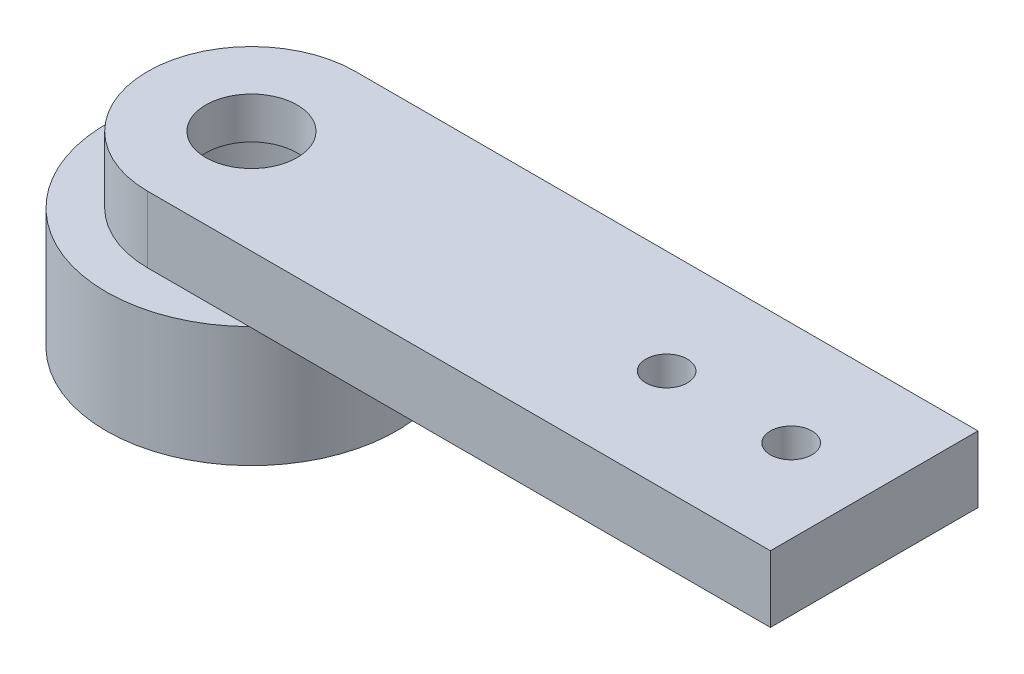
ISO-10303-21;
HEADER;
FILE_DESCRIPTION(('STEP AP214'),'2;1');
FILE_NAME('part.step','',(''),(''),'','','');
FILE_SCHEMA(('AUTOMOTIVE_DESIGN { 1 0 10303 214 1 1 1 1 }'));
ENDSEC;
DATA;
#1=APPLICATION_CONTEXT('core data for automotive mechanical design processes');
#2=APPLICATION_PROTOCOL_DEFINITION('international standard','automotive_design',2000,#1);
#3=PRODUCT_CONTEXT('',#1,'mechanical');
#4=PRODUCT('Part','Part','',(#3));
#5=PRODUCT_RELATED_PRODUCT_CATEGORY('part','',(#4));
#6=PRODUCT_DEFINITION_FORMATION('','',#4);
#7=PRODUCT_DEFINITION_CONTEXT('part definition',#1,'design');
#8=PRODUCT_DEFINITION('design','',#6,#7);
#9=PRODUCT_DEFINITION_SHAPE('','',#8);
#10=(LENGTH_UNIT() NAMED_UNIT(*) SI_UNIT(.MILLI.,.METRE.));
#11=(NAMED_UNIT(*) PLANE_ANGLE_UNIT() SI_UNIT($,.RADIAN.));
#12=(NAMED_UNIT(*) SI_UNIT($,.STERADIAN.) SOLID_ANGLE_UNIT());
#13=UNCERTAINTY_MEASURE_WITH_UNIT(LENGTH_MEASURE(1.E-05),#10,'distance_accuracy_value','');
#14=(GEOMETRIC_REPRESENTATION_CONTEXT(3) GLOBAL_UNCERTAINTY_ASSIGNED_CONTEXT((#13)) GLOBAL_UNIT_ASSIGNED_CONTEXT((#10,
#11,#12)) REPRESENTATION_CONTEXT('',''));
#15=CARTESIAN_POINT('',(0.,0.,0.));
#16=DIRECTION('',(0.,0.,1.));
#17=DIRECTION('',(1.,0.,0.));
#18=AXIS2_PLACEMENT_3D('',#15,#16,#17);
#19=CARTESIAN_POINT('',(5.5,20.9,0.));
#20=DIRECTION('',(0.,-1.,0.));
#21=DIRECTION('',(0.,0.,-1.));
#22=AXIS2_PLACEMENT_3D('',#19,#20,#21);
#23=CYLINDRICAL_SURFACE('',#22,2.5);
#24=CARTESIAN_POINT('',(5.5,19.3,0.));
#25=DIRECTION('',(0.,1.,0.));
#26=DIRECTION('',(0.,0.,1.));
#27=AXIS2_PLACEMENT_3D('',#24,#25,#26);
#28=CIRCLE('',#27,2.5);
#29=CARTESIAN_POINT('',(5.5,19.3,-2.5));
#30=VERTEX_POINT('',#29);
#31=CARTESIAN_POINT('',(5.5,19.3,2.5));
#32=VERTEX_POINT('',#31);
#33=EDGE_CURVE('E111',#30,#32,#28,.T.);
#34=ORIENTED_EDGE('',*,*,#33,.T.);
#35=DIRECTION('',(0.,-1.,0.));
#36=VECTOR('',#35,1.);
#37=CARTESIAN_POINT('',(5.5,20.9,2.5));
#38=LINE('',#37,#36);
#39=CARTESIAN_POINT('',(5.5,20.9,2.5));
#40=VERTEX_POINT('',#39);
#41=EDGE_CURVE('E11',#40,#32,#38,.T.);
#42=ORIENTED_EDGE('',*,*,#41,.F.);
#43=CARTESIAN_POINT('',(5.5,20.9,0.));
#44=DIRECTION('',(0.,1.,0.));
#45=DIRECTION('',(0.,0.,1.));
#46=AXIS2_PLACEMENT_3D('',#43,#44,#45);
#47=CIRCLE('',#46,2.5);
#48=CARTESIAN_POINT('',(5.5,20.9,-2.5));
#49=VERTEX_POINT('',#48);
#50=EDGE_CURVE('E128',#49,#40,#47,.T.);
#51=ORIENTED_EDGE('',*,*,#50,.F.);
#52=DIRECTION('',(0.,-1.,0.));
#53=VECTOR('',#52,1.);
#54=CARTESIAN_POINT('',(5.5,20.9,-2.5));
#55=LINE('',#54,#53);
#56=EDGE_CURVE('E129',#49,#30,#55,.T.);
#57=ORIENTED_EDGE('',*,*,#56,.T.);
#58=EDGE_LOOP('',(#34,#42,#51,#57));
#59=FACE_BOUND('',#58,.T.);
#60=ADVANCED_FACE('F39',(#59),#23,.T.);
#61=CARTESIAN_POINT('',(5.5,20.9,2.5));
#62=DIRECTION('',(0.,0.,-1.));
#63=DIRECTION('',(-1.,0.,0.));
#64=AXIS2_PLACEMENT_3D('',#61,#62,#63);
#65=PLANE('',#64);
#66=DIRECTION('',(1.,0.,0.));
#67=VECTOR('',#66,1.);
#68=CARTESIAN_POINT('',(5.5,19.3,2.5));
#69=LINE('',#68,#67);
#70=CARTESIAN_POINT('',(7.94948974278318,19.3,2.5));
#71=VERTEX_POINT('',#70);
#72=EDGE_CURVE('E96',#32,#71,#69,.T.);
#73=ORIENTED_EDGE('',*,*,#72,.T.);
#74=CARTESIAN_POINT('',(20.5,19.3,2.5));
#75=VERTEX_POINT('',#74);
#76=EDGE_CURVE('E112',#71,#75,#69,.T.);
#77=ORIENTED_EDGE('',*,*,#76,.T.);
#78=DIRECTION('',(0.,-1.,0.));
#79=VECTOR('',#78,1.);
#80=CARTESIAN_POINT('',(20.5,20.9,2.5));
#81=LINE('',#80,#79);
#82=CARTESIAN_POINT('',(20.5,20.9,2.5));
#83=VERTEX_POINT('',#82);
#84=EDGE_CURVE('E47',#83,#75,#81,.T.);
#85=ORIENTED_EDGE('',*,*,#84,.F.);
#86=DIRECTION('',(1.,0.,0.));
#87=VECTOR('',#86,1.);
#88=CARTESIAN_POINT('',(5.5,20.9,2.5));
#89=LINE('',#88,#87);
#90=EDGE_CURVE('E85',#40,#83,#89,.T.);
#91=ORIENTED_EDGE('',*,*,#90,.F.);
#92=ORIENTED_EDGE('',*,*,#41,.T.);
#93=EDGE_LOOP('',(#73,#77,#85,#91,#92));
#94=FACE_BOUND('',#93,.T.);
#95=ADVANCED_FACE('F116',(#94),#65,.F.);
#96=CARTESIAN_POINT('',(20.5,20.9,2.5));
#97=DIRECTION('',(-1.,0.,0.));
#98=DIRECTION('',(0.,0.,1.));
#99=AXIS2_PLACEMENT_3D('',#96,#97,#98);
#100=PLANE('',#99);
#101=DIRECTION('',(0.,0.,-1.));
#102=VECTOR('',#101,1.);
#103=CARTESIAN_POINT('',(20.5,19.3,2.5));
#104=LINE('',#103,#102);
#105=CARTESIAN_POINT('',(20.5,19.3,-2.5));
#106=VERTEX_POINT('',#105);
#107=EDGE_CURVE('E78',#75,#106,#104,.T.);
#108=ORIENTED_EDGE('',*,*,#107,.T.);
#109=DIRECTION('',(0.,-1.,0.));
#110=VECTOR('',#109,1.);
#111=CARTESIAN_POINT('',(20.5,20.9,-2.5));
#112=LINE('',#111,#110);
#113=CARTESIAN_POINT('',(20.5,20.9,-2.5));
#114=VERTEX_POINT('',#113);
#115=EDGE_CURVE('E133',#114,#106,#112,.T.);
#116=ORIENTED_EDGE('',*,*,#115,.F.);
#117=DIRECTION('',(0.,0.,-1.));
#118=VECTOR('',#117,1.);
#119=CARTESIAN_POINT('',(20.5,20.9,2.5));
#120=LINE('',#119,#118);
#121=EDGE_CURVE('E138',#83,#114,#120,.T.);
#122=ORIENTED_EDGE('',*,*,#121,.F.);
#123=ORIENTED_EDGE('',*,*,#84,.T.);
#124=EDGE_LOOP('',(#108,#116,#122,#123));
#125=FACE_BOUND('',#124,.T.);
#126=ADVANCED_FACE('F137',(#125),#100,.F.);
#127=CARTESIAN_POINT('',(20.5,20.9,-2.5));
#128=DIRECTION('',(0.,0.,1.));
#129=DIRECTION('',(1.,0.,0.));
#130=AXIS2_PLACEMENT_3D('',#127,#128,#129);
#131=PLANE('',#130);
#132=DIRECTION('',(-1.,0.,0.));
#133=VECTOR('',#132,1.);
#134=CARTESIAN_POINT('',(20.5,19.3,-2.5));
#135=LINE('',#134,#133);
#136=CARTESIAN_POINT('',(7.94948974278318,19.3,-2.5));
#137=VERTEX_POINT('',#136);
#138=EDGE_CURVE('E125',#106,#137,#135,.T.);
#139=ORIENTED_EDGE('',*,*,#138,.T.);
#140=EDGE_CURVE('E98',#137,#30,#135,.T.);
#141=ORIENTED_EDGE('',*,*,#140,.T.);
#142=ORIENTED_EDGE('',*,*,#56,.F.);
#143=DIRECTION('',(-1.,0.,0.));
#144=VECTOR('',#143,1.);
#145=CARTESIAN_POINT('',(20.5,20.9,-2.5));
#146=LINE('',#145,#144);
#147=EDGE_CURVE('E62',#114,#49,#146,.T.);
#148=ORIENTED_EDGE('',*,*,#147,.F.);
#149=ORIENTED_EDGE('',*,*,#115,.T.);
#150=EDGE_LOOP('',(#139,#141,#142,#148,#149));
#151=FACE_BOUND('',#150,.T.);
#152=ADVANCED_FACE('F189',(#151),#131,.F.);
#153=CARTESIAN_POINT('',(5.5,20.9,0.));
#154=DIRECTION('',(0.,1.,0.));
#155=DIRECTION('',(0.,0.,1.));
#156=AXIS2_PLACEMENT_3D('',#153,#154,#155);
#157=PLANE('',#156);
#158=CARTESIAN_POINT('',(18.5,20.9,0.));
#159=DIRECTION('',(0.,1.,0.));
#160=DIRECTION('',(0.,0.,1.));
#161=AXIS2_PLACEMENT_3D('',#158,#159,#160);
#162=CIRCLE('',#161,0.499999999999999);
#163=CARTESIAN_POINT('',(18.5,20.9,0.499999999999999));
#164=VERTEX_POINT('',#163);
#165=EDGE_CURVE('E171',#164,#164,#162,.T.);
#166=ORIENTED_EDGE('',*,*,#165,.F.);
#167=EDGE_LOOP('',(#166));
#168=FACE_BOUND('',#167,.T.);
#169=CARTESIAN_POINT('',(15.5,20.9,0.));
#170=DIRECTION('',(0.,1.,0.));
#171=DIRECTION('',(0.,0.,1.));
#172=AXIS2_PLACEMENT_3D('',#169,#170,#171);
#173=CIRCLE('',#172,0.499999999999999);
#174=CARTESIAN_POINT('',(15.5,20.9,0.499999999999999));
#175=VERTEX_POINT('',#174);
#176=EDGE_CURVE('E163',#175,#175,#173,.T.);
#177=ORIENTED_EDGE('',*,*,#176,.F.);
#178=EDGE_LOOP('',(#177));
#179=FACE_BOUND('',#178,.T.);
#180=CARTESIAN_POINT('',(5.5,20.9,0.));
#181=DIRECTION('',(0.,1.,0.));
#182=DIRECTION('',(0.,0.,1.));
#183=AXIS2_PLACEMENT_3D('',#180,#181,#182);
#184=CIRCLE('',#183,1.1);
#185=CARTESIAN_POINT('',(5.5,20.9,1.1));
#186=VERTEX_POINT('',#185);
#187=EDGE_CURVE('E155',#186,#186,#184,.T.);
#188=ORIENTED_EDGE('',*,*,#187,.F.);
#189=EDGE_LOOP('',(#188));
#190=FACE_BOUND('',#189,.T.);
#191=ORIENTED_EDGE('',*,*,#50,.T.);
#192=ORIENTED_EDGE('',*,*,#90,.T.);
#193=ORIENTED_EDGE('',*,*,#121,.T.);
#194=ORIENTED_EDGE('',*,*,#147,.T.);
#195=EDGE_LOOP('',(#191,#192,#193,#194));
#196=FACE_BOUND('',#195,.T.);
#197=ADVANCED_FACE('F186',(#168,#179,#190,#196),#157,.T.);
#198=CARTESIAN_POINT('',(5.5,19.3,0.));
#199=DIRECTION('',(0.,1.,0.));
#200=DIRECTION('',(0.,0.,1.));
#201=AXIS2_PLACEMENT_3D('',#198,#199,#200);
#202=PLANE('',#201);
#203=CARTESIAN_POINT('',(18.5,19.3,0.));
#204=DIRECTION('',(0.,1.,0.));
#205=DIRECTION('',(0.,0.,1.));
#206=AXIS2_PLACEMENT_3D('',#203,#204,#205);
#207=CIRCLE('',#206,0.499999999999999);
#208=CARTESIAN_POINT('',(18.5,19.3,0.499999999999999));
#209=VERTEX_POINT('',#208);
#210=EDGE_CURVE('E175',#209,#209,#207,.T.);
#211=ORIENTED_EDGE('',*,*,#210,.T.);
#212=EDGE_LOOP('',(#211));
#213=FACE_BOUND('',#212,.T.);
#214=CARTESIAN_POINT('',(15.5,19.3,0.));
#215=DIRECTION('',(0.,1.,0.));
#216=DIRECTION('',(0.,0.,1.));
#217=AXIS2_PLACEMENT_3D('',#214,#215,#216);
#218=CIRCLE('',#217,0.499999999999999);
#219=CARTESIAN_POINT('',(15.5,19.3,0.499999999999999));
#220=VERTEX_POINT('',#219);
#221=EDGE_CURVE('E167',#220,#220,#218,.T.);
#222=ORIENTED_EDGE('',*,*,#221,.T.);
#223=EDGE_LOOP('',(#222));
#224=FACE_BOUND('',#223,.T.);
#225=ORIENTED_EDGE('',*,*,#76,.F.);
#226=CARTESIAN_POINT('',(5.5,19.3,0.));
#227=DIRECTION('',(0.,1.,0.));
#228=DIRECTION('',(0.,0.,1.));
#229=AXIS2_PLACEMENT_3D('',#226,#227,#228);
#230=CIRCLE('',#229,3.5);
#231=EDGE_CURVE('E101',#71,#137,#230,.T.);
#232=ORIENTED_EDGE('',*,*,#231,.T.);
#233=ORIENTED_EDGE('',*,*,#138,.F.);
#234=ORIENTED_EDGE('',*,*,#107,.F.);
#235=EDGE_LOOP('',(#225,#232,#233,#234));
#236=FACE_BOUND('',#235,.T.);
#237=ADVANCED_FACE('F113',(#213,#224,#236),#202,.F.);
#238=CARTESIAN_POINT('',(5.5,19.3,0.));
#239=DIRECTION('',(0.,1.,0.));
#240=DIRECTION('',(0.,0.,1.));
#241=AXIS2_PLACEMENT_3D('',#238,#239,#240);
#242=PLANE('',#241);
#243=ORIENTED_EDGE('',*,*,#140,.F.);
#244=EDGE_CURVE('E53',#137,#71,#230,.T.);
#245=ORIENTED_EDGE('',*,*,#244,.T.);
#246=ORIENTED_EDGE('',*,*,#72,.F.);
#247=ORIENTED_EDGE('',*,*,#33,.F.);
#248=EDGE_LOOP('',(#243,#245,#246,#247));
#249=FACE_BOUND('',#248,.T.);
#250=ADVANCED_FACE('F94',(#249),#242,.T.);
#251=CARTESIAN_POINT('',(5.5,19.3,0.));
#252=DIRECTION('',(0.,-1.,0.));
#253=DIRECTION('',(0.,0.,-1.));
#254=AXIS2_PLACEMENT_3D('',#251,#252,#253);
#255=CYLINDRICAL_SURFACE('',#254,3.5);
#256=ORIENTED_EDGE('',*,*,#231,.F.);
#257=ORIENTED_EDGE('',*,*,#244,.F.);
#258=EDGE_LOOP('',(#256,#257));
#259=FACE_BOUND('',#258,.T.);
#260=CARTESIAN_POINT('',(5.5,16.4,0.));
#261=DIRECTION('',(0.,1.,0.));
#262=DIRECTION('',(0.,0.,1.));
#263=AXIS2_PLACEMENT_3D('',#260,#261,#262);
#264=CIRCLE('',#263,3.5);
#265=CARTESIAN_POINT('',(5.5,16.4,3.5));
#266=VERTEX_POINT('',#265);
#267=EDGE_CURVE('E102',#266,#266,#264,.T.);
#268=ORIENTED_EDGE('',*,*,#267,.T.);
#269=EDGE_LOOP('',(#268));
#270=FACE_BOUND('',#269,.T.);
#271=ADVANCED_FACE('F105',(#259,#270),#255,.T.);
#272=CARTESIAN_POINT('',(5.5,16.4,0.));
#273=DIRECTION('',(0.,1.,0.));
#274=DIRECTION('',(0.,0.,1.));
#275=AXIS2_PLACEMENT_3D('',#272,#273,#274);
#276=PLANE('',#275);
#277=CARTESIAN_POINT('',(5.5,16.4,0.));
#278=DIRECTION('',(0.,1.,0.));
#279=DIRECTION('',(0.,0.,1.));
#280=AXIS2_PLACEMENT_3D('',#277,#278,#279);
#281=CIRCLE('',#280,2.425);
#282=CARTESIAN_POINT('',(5.5,16.4,2.425));
#283=VERTEX_POINT('',#282);
#284=EDGE_CURVE('E151',#283,#283,#281,.T.);
#285=ORIENTED_EDGE('',*,*,#284,.T.);
#286=EDGE_LOOP('',(#285));
#287=FACE_BOUND('',#286,.T.);
#288=ORIENTED_EDGE('',*,*,#267,.F.);
#289=EDGE_LOOP('',(#288));
#290=FACE_BOUND('',#289,.T.);
#291=ADVANCED_FACE('F257',(#287,#290),#276,.F.);
#292=CARTESIAN_POINT('',(5.5,19.9,0.));
#293=DIRECTION('',(0.,-1.,0.));
#294=DIRECTION('',(0.,0.,-1.));
#295=AXIS2_PLACEMENT_3D('',#292,#293,#294);
#296=CYLINDRICAL_SURFACE('',#295,2.425);
#297=CARTESIAN_POINT('',(5.5,19.9,0.));
#298=DIRECTION('',(0.,1.,0.));
#299=DIRECTION('',(0.,0.,1.));
#300=AXIS2_PLACEMENT_3D('',#297,#298,#299);
#301=CIRCLE('',#300,2.425);
#302=CARTESIAN_POINT('',(5.5,19.9,2.425));
#303=VERTEX_POINT('',#302);
#304=EDGE_CURVE('E149',#303,#303,#301,.T.);
#305=ORIENTED_EDGE('',*,*,#304,.T.);
#306=EDGE_LOOP('',(#305));
#307=FACE_BOUND('',#306,.T.);
#308=ORIENTED_EDGE('',*,*,#284,.F.);
#309=EDGE_LOOP('',(#308));
#310=FACE_BOUND('',#309,.T.);
#311=ADVANCED_FACE('F265',(#307,#310),#296,.F.);
#312=CARTESIAN_POINT('',(5.5,19.9,0.));
#313=DIRECTION('',(0.,1.,0.));
#314=DIRECTION('',(0.,0.,1.));
#315=AXIS2_PLACEMENT_3D('',#312,#313,#314);
#316=PLANE('',#315);
#317=CARTESIAN_POINT('',(5.5,19.9,0.));
#318=DIRECTION('',(0.,1.,0.));
#319=DIRECTION('',(0.,0.,1.));
#320=AXIS2_PLACEMENT_3D('',#317,#318,#319);
#321=CIRCLE('',#320,1.1);
#322=CARTESIAN_POINT('',(5.5,19.9,1.1));
#323=VERTEX_POINT('',#322);
#324=EDGE_CURVE('E159',#323,#323,#321,.T.);
#325=ORIENTED_EDGE('',*,*,#324,.T.);
#326=EDGE_LOOP('',(#325));
#327=FACE_BOUND('',#326,.T.);
#328=ORIENTED_EDGE('',*,*,#304,.F.);
#329=EDGE_LOOP('',(#328));
#330=FACE_BOUND('',#329,.T.);
#331=ADVANCED_FACE('F274',(#327,#330),#316,.F.);
#332=CARTESIAN_POINT('',(5.5,20.9,0.));
#333=DIRECTION('',(0.,-1.,0.));
#334=DIRECTION('',(0.,0.,-1.));
#335=AXIS2_PLACEMENT_3D('',#332,#333,#334);
#336=CYLINDRICAL_SURFACE('',#335,1.1);
#337=ORIENTED_EDGE('',*,*,#187,.T.);
#338=EDGE_LOOP('',(#337));
#339=FACE_BOUND('',#338,.T.);
#340=ORIENTED_EDGE('',*,*,#324,.F.);
#341=EDGE_LOOP('',(#340));
#342=FACE_BOUND('',#341,.T.);
#343=ADVANCED_FACE('F283',(#339,#342),#336,.F.);
#344=CARTESIAN_POINT('',(15.5,20.9,0.));
#345=DIRECTION('',(0.,-1.,0.));
#346=DIRECTION('',(0.,0.,-1.));
#347=AXIS2_PLACEMENT_3D('',#344,#345,#346);
#348=CYLINDRICAL_SURFACE('',#347,0.499999999999999);
#349=ORIENTED_EDGE('',*,*,#176,.T.);
#350=EDGE_LOOP('',(#349));
#351=FACE_BOUND('',#350,.T.);
#352=ORIENTED_EDGE('',*,*,#221,.F.);
#353=EDGE_LOOP('',(#352));
#354=FACE_BOUND('',#353,.T.);
#355=ADVANCED_FACE('F292',(#351,#354),#348,.F.);
#356=CARTESIAN_POINT('',(18.5,20.9,0.));
#357=DIRECTION('',(0.,-1.,0.));
#358=DIRECTION('',(0.,0.,-1.));
#359=AXIS2_PLACEMENT_3D('',#356,#357,#358);
#360=CYLINDRICAL_SURFACE('',#359,0.499999999999999);
#361=ORIENTED_EDGE('',*,*,#165,.T.);
#362=EDGE_LOOP('',(#361));
#363=FACE_BOUND('',#362,.T.);
#364=ORIENTED_EDGE('',*,*,#210,.F.);
#365=EDGE_LOOP('',(#364));
#366=FACE_BOUND('',#365,.T.);
#367=ADVANCED_FACE('F183',(#363,#366),#360,.F.);
#368=CLOSED_SHELL('',(#60,#95,#126,#152,#197,#237,#250,#271,#291,#311,#331,#343,#355,#367));
#369=MANIFOLD_SOLID_BREP('B2',#368);
#370=ADVANCED_BREP_SHAPE_REPRESENTATION('',(#18,#369),#14);
#371=SHAPE_DEFINITION_REPRESENTATION(#9,#370);
ENDSEC;
END-ISO-10303-21;
